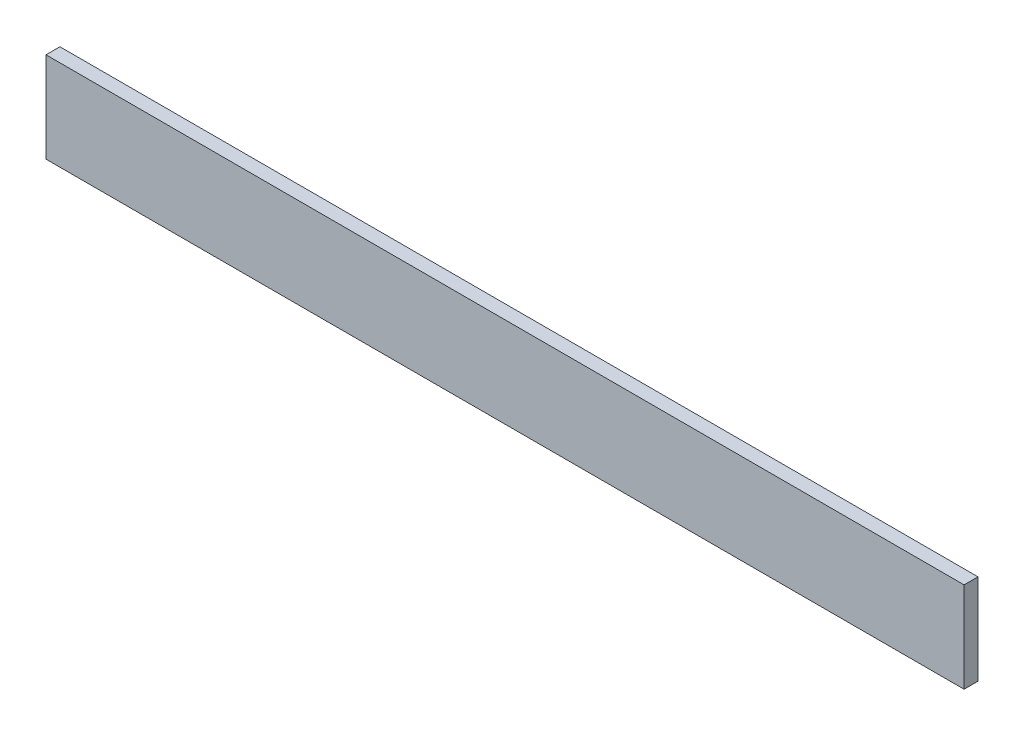
ISO-10303-21;
HEADER;
FILE_DESCRIPTION(('STEP AP214'),'2;1');
FILE_NAME('part.step','',(''),(''),'','','');
FILE_SCHEMA(('AUTOMOTIVE_DESIGN { 1 0 10303 214 1 1 1 1 }'));
ENDSEC;
DATA;
#1=APPLICATION_CONTEXT('core data for automotive mechanical design processes');
#2=APPLICATION_PROTOCOL_DEFINITION('international standard','automotive_design',2000,#1);
#3=PRODUCT_CONTEXT('',#1,'mechanical');
#4=PRODUCT('Part','Part','',(#3));
#5=PRODUCT_RELATED_PRODUCT_CATEGORY('part','',(#4));
#6=PRODUCT_DEFINITION_FORMATION('','',#4);
#7=PRODUCT_DEFINITION_CONTEXT('part definition',#1,'design');
#8=PRODUCT_DEFINITION('design','',#6,#7);
#9=PRODUCT_DEFINITION_SHAPE('','',#8);
#10=(LENGTH_UNIT() NAMED_UNIT(*) SI_UNIT(.MILLI.,.METRE.));
#11=(NAMED_UNIT(*) PLANE_ANGLE_UNIT() SI_UNIT($,.RADIAN.));
#12=(NAMED_UNIT(*) SI_UNIT($,.STERADIAN.) SOLID_ANGLE_UNIT());
#13=UNCERTAINTY_MEASURE_WITH_UNIT(LENGTH_MEASURE(1.E-05),#10,'distance_accuracy_value','');
#14=(GEOMETRIC_REPRESENTATION_CONTEXT(3) GLOBAL_UNCERTAINTY_ASSIGNED_CONTEXT((#13)) GLOBAL_UNIT_ASSIGNED_CONTEXT((#10,
#11,#12)) REPRESENTATION_CONTEXT('',''));
#15=CARTESIAN_POINT('',(0.,0.,0.));
#16=DIRECTION('',(0.,0.,1.));
#17=DIRECTION('',(1.,0.,0.));
#18=AXIS2_PLACEMENT_3D('',#15,#16,#17);
#19=CARTESIAN_POINT('',(660.,-65.,20.));
#20=DIRECTION('',(-1.,0.,0.));
#21=DIRECTION('',(0.,0.,1.));
#22=AXIS2_PLACEMENT_3D('',#19,#20,#21);
#23=PLANE('',#22);
#24=DIRECTION('',(0.,1.,0.));
#25=VECTOR('',#24,1.);
#26=CARTESIAN_POINT('',(660.,-65.,0.));
#27=LINE('',#26,#25);
#28=CARTESIAN_POINT('',(660.,-65.,0.));
#29=VERTEX_POINT('',#28);
#30=CARTESIAN_POINT('',(660.,65.,0.));
#31=VERTEX_POINT('',#30);
#32=EDGE_CURVE('E109',#29,#31,#27,.T.);
#33=ORIENTED_EDGE('',*,*,#32,.T.);
#34=DIRECTION('',(0.,0.,-1.));
#35=VECTOR('',#34,1.);
#36=CARTESIAN_POINT('',(660.,65.,20.));
#37=LINE('',#36,#35);
#38=CARTESIAN_POINT('',(660.,65.,20.));
#39=VERTEX_POINT('',#38);
#40=EDGE_CURVE('E11',#39,#31,#37,.T.);
#41=ORIENTED_EDGE('',*,*,#40,.F.);
#42=DIRECTION('',(0.,1.,0.));
#43=VECTOR('',#42,1.);
#44=CARTESIAN_POINT('',(660.,-65.,20.));
#45=LINE('',#44,#43);
#46=CARTESIAN_POINT('',(660.,-65.,20.));
#47=VERTEX_POINT('',#46);
#48=EDGE_CURVE('E93',#47,#39,#45,.T.);
#49=ORIENTED_EDGE('',*,*,#48,.F.);
#50=DIRECTION('',(0.,0.,-1.));
#51=VECTOR('',#50,1.);
#52=CARTESIAN_POINT('',(660.,-65.,20.));
#53=LINE('',#52,#51);
#54=EDGE_CURVE('E105',#47,#29,#53,.T.);
#55=ORIENTED_EDGE('',*,*,#54,.T.);
#56=EDGE_LOOP('',(#33,#41,#49,#55));
#57=FACE_BOUND('',#56,.T.);
#58=ADVANCED_FACE('F41',(#57),#23,.F.);
#59=CARTESIAN_POINT('',(-660.,65.,20.));
#60=DIRECTION('',(0.,-1.,0.));
#61=DIRECTION('',(0.,0.,-1.));
#62=AXIS2_PLACEMENT_3D('',#59,#60,#61);
#63=PLANE('',#62);
#64=DIRECTION('',(-1.,0.,0.));
#65=VECTOR('',#64,1.);
#66=CARTESIAN_POINT('',(-660.,65.,0.));
#67=LINE('',#66,#65);
#68=CARTESIAN_POINT('',(-660.,65.,0.));
#69=VERTEX_POINT('',#68);
#70=EDGE_CURVE('E98',#31,#69,#67,.T.);
#71=ORIENTED_EDGE('',*,*,#70,.T.);
#72=DIRECTION('',(0.,0.,-1.));
#73=VECTOR('',#72,1.);
#74=CARTESIAN_POINT('',(-660.,65.,20.));
#75=LINE('',#74,#73);
#76=CARTESIAN_POINT('',(-660.,65.,20.));
#77=VERTEX_POINT('',#76);
#78=EDGE_CURVE('E50',#77,#69,#75,.T.);
#79=ORIENTED_EDGE('',*,*,#78,.F.);
#80=DIRECTION('',(-1.,0.,0.));
#81=VECTOR('',#80,1.);
#82=CARTESIAN_POINT('',(-660.,65.,20.));
#83=LINE('',#82,#81);
#84=EDGE_CURVE('E88',#39,#77,#83,.T.);
#85=ORIENTED_EDGE('',*,*,#84,.F.);
#86=ORIENTED_EDGE('',*,*,#40,.T.);
#87=EDGE_LOOP('',(#71,#79,#85,#86));
#88=FACE_BOUND('',#87,.T.);
#89=ADVANCED_FACE('F97',(#88),#63,.F.);
#90=CARTESIAN_POINT('',(-660.,-65.,20.));
#91=DIRECTION('',(1.,0.,0.));
#92=DIRECTION('',(0.,0.,-1.));
#93=AXIS2_PLACEMENT_3D('',#90,#91,#92);
#94=PLANE('',#93);
#95=DIRECTION('',(0.,-1.,0.));
#96=VECTOR('',#95,1.);
#97=CARTESIAN_POINT('',(-660.,-65.,0.));
#98=LINE('',#97,#96);
#99=CARTESIAN_POINT('',(-660.,-65.,0.));
#100=VERTEX_POINT('',#99);
#101=EDGE_CURVE('E75',#69,#100,#98,.T.);
#102=ORIENTED_EDGE('',*,*,#101,.T.);
#103=DIRECTION('',(0.,0.,-1.));
#104=VECTOR('',#103,1.);
#105=CARTESIAN_POINT('',(-660.,-65.,20.));
#106=LINE('',#105,#104);
#107=CARTESIAN_POINT('',(-660.,-65.,20.));
#108=VERTEX_POINT('',#107);
#109=EDGE_CURVE('E100',#108,#100,#106,.T.);
#110=ORIENTED_EDGE('',*,*,#109,.F.);
#111=DIRECTION('',(0.,-1.,0.));
#112=VECTOR('',#111,1.);
#113=CARTESIAN_POINT('',(-660.,-65.,20.));
#114=LINE('',#113,#112);
#115=EDGE_CURVE('E91',#77,#108,#114,.T.);
#116=ORIENTED_EDGE('',*,*,#115,.F.);
#117=ORIENTED_EDGE('',*,*,#78,.T.);
#118=EDGE_LOOP('',(#102,#110,#116,#117));
#119=FACE_BOUND('',#118,.T.);
#120=ADVANCED_FACE('F101',(#119),#94,.F.);
#121=CARTESIAN_POINT('',(-660.,-65.,20.));
#122=DIRECTION('',(0.,1.,0.));
#123=DIRECTION('',(0.,0.,1.));
#124=AXIS2_PLACEMENT_3D('',#121,#122,#123);
#125=PLANE('',#124);
#126=DIRECTION('',(1.,0.,0.));
#127=VECTOR('',#126,1.);
#128=CARTESIAN_POINT('',(-660.,-65.,0.));
#129=LINE('',#128,#127);
#130=EDGE_CURVE('E81',#100,#29,#129,.T.);
#131=ORIENTED_EDGE('',*,*,#130,.T.);
#132=ORIENTED_EDGE('',*,*,#54,.F.);
#133=DIRECTION('',(1.,0.,0.));
#134=VECTOR('',#133,1.);
#135=CARTESIAN_POINT('',(-660.,-65.,20.));
#136=LINE('',#135,#134);
#137=EDGE_CURVE('E58',#108,#47,#136,.T.);
#138=ORIENTED_EDGE('',*,*,#137,.F.);
#139=ORIENTED_EDGE('',*,*,#109,.T.);
#140=EDGE_LOOP('',(#131,#132,#138,#139));
#141=FACE_BOUND('',#140,.T.);
#142=ADVANCED_FACE('F122',(#141),#125,.F.);
#143=CARTESIAN_POINT('',(0.,0.,20.));
#144=DIRECTION('',(0.,0.,-1.));
#145=DIRECTION('',(-1.,0.,0.));
#146=AXIS2_PLACEMENT_3D('',#143,#144,#145);
#147=PLANE('',#146);
#148=ORIENTED_EDGE('',*,*,#48,.T.);
#149=ORIENTED_EDGE('',*,*,#84,.T.);
#150=ORIENTED_EDGE('',*,*,#115,.T.);
#151=ORIENTED_EDGE('',*,*,#137,.T.);
#152=EDGE_LOOP('',(#148,#149,#150,#151));
#153=FACE_BOUND('',#152,.T.);
#154=ADVANCED_FACE('F89',(#153),#147,.F.);
#155=CARTESIAN_POINT('',(0.,0.,0.));
#156=DIRECTION('',(0.,0.,-1.));
#157=DIRECTION('',(-1.,0.,0.));
#158=AXIS2_PLACEMENT_3D('',#155,#156,#157);
#159=PLANE('',#158);
#160=ORIENTED_EDGE('',*,*,#32,.F.);
#161=ORIENTED_EDGE('',*,*,#130,.F.);
#162=ORIENTED_EDGE('',*,*,#101,.F.);
#163=ORIENTED_EDGE('',*,*,#70,.F.);
#164=EDGE_LOOP('',(#160,#161,#162,#163));
#165=FACE_BOUND('',#164,.T.);
#166=ADVANCED_FACE('F125',(#165),#159,.T.);
#167=CLOSED_SHELL('',(#58,#89,#120,#142,#154,#166));
#168=MANIFOLD_SOLID_BREP('B2',#167);
#169=ADVANCED_BREP_SHAPE_REPRESENTATION('',(#18,#168),#14);
#170=SHAPE_DEFINITION_REPRESENTATION(#9,#169);
ENDSEC;
END-ISO-10303-21;
